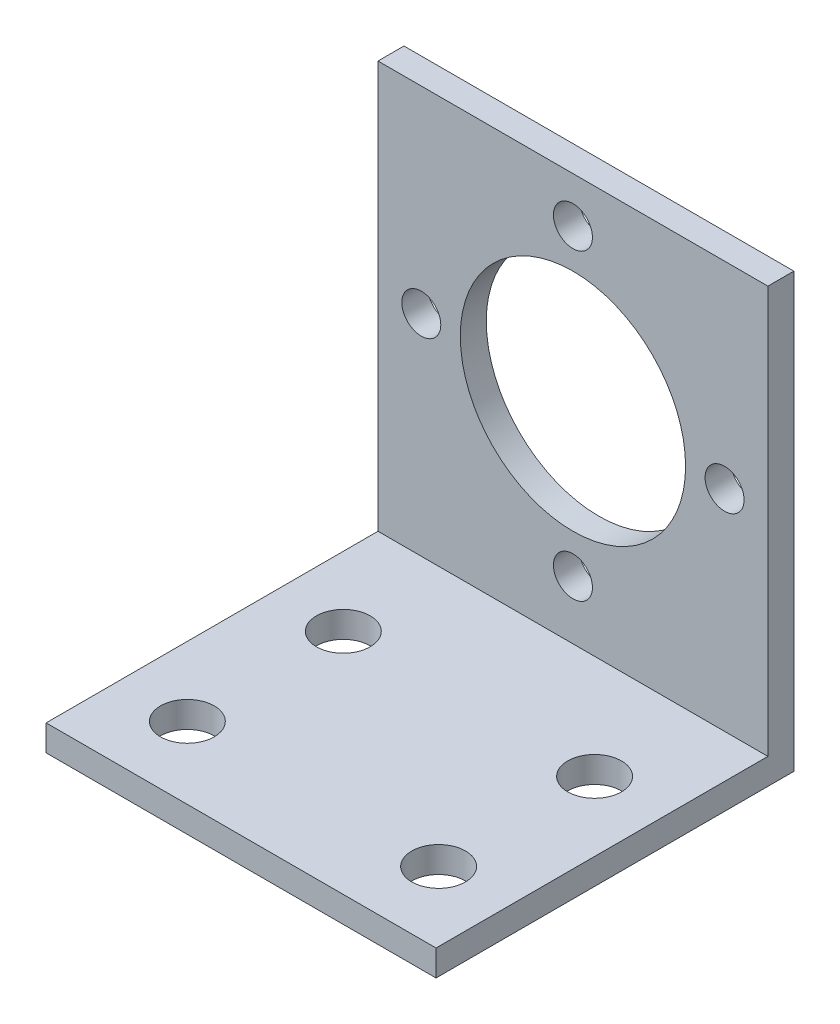
ISO-10303-21;
HEADER;
FILE_DESCRIPTION(('STEP AP214'),'2;1');
FILE_NAME('part.step','',(''),(''),'','','');
FILE_SCHEMA(('AUTOMOTIVE_DESIGN { 1 0 10303 214 1 1 1 1 }'));
ENDSEC;
DATA;
#1=APPLICATION_CONTEXT('core data for automotive mechanical design processes');
#2=APPLICATION_PROTOCOL_DEFINITION('international standard','automotive_design',2000,#1);
#3=PRODUCT_CONTEXT('',#1,'mechanical');
#4=PRODUCT('Part','Part','',(#3));
#5=PRODUCT_RELATED_PRODUCT_CATEGORY('part','',(#4));
#6=PRODUCT_DEFINITION_FORMATION('','',#4);
#7=PRODUCT_DEFINITION_CONTEXT('part definition',#1,'design');
#8=PRODUCT_DEFINITION('design','',#6,#7);
#9=PRODUCT_DEFINITION_SHAPE('','',#8);
#10=(LENGTH_UNIT() NAMED_UNIT(*) SI_UNIT(.MILLI.,.METRE.));
#11=(NAMED_UNIT(*) PLANE_ANGLE_UNIT() SI_UNIT($,.RADIAN.));
#12=(NAMED_UNIT(*) SI_UNIT($,.STERADIAN.) SOLID_ANGLE_UNIT());
#13=UNCERTAINTY_MEASURE_WITH_UNIT(LENGTH_MEASURE(1.E-05),#10,'distance_accuracy_value','');
#14=(GEOMETRIC_REPRESENTATION_CONTEXT(3) GLOBAL_UNCERTAINTY_ASSIGNED_CONTEXT((#13)) GLOBAL_UNIT_ASSIGNED_CONTEXT((#10,
#11,#12)) REPRESENTATION_CONTEXT('',''));
#15=CARTESIAN_POINT('',(0.,0.,0.));
#16=DIRECTION('',(0.,0.,1.));
#17=DIRECTION('',(1.,0.,0.));
#18=AXIS2_PLACEMENT_3D('',#15,#16,#17);
#19=CARTESIAN_POINT('',(0.,0.,3.));
#20=DIRECTION('',(1.,0.,0.));
#21=DIRECTION('',(0.,0.,-1.));
#22=AXIS2_PLACEMENT_3D('',#19,#20,#21);
#23=PLANE('',#22);
#24=DIRECTION('',(0.,-1.,0.));
#25=VECTOR('',#24,1.);
#26=CARTESIAN_POINT('',(0.,0.,0.));
#27=LINE('',#26,#25);
#28=CARTESIAN_POINT('',(0.,50.,0.));
#29=VERTEX_POINT('',#28);
#30=CARTESIAN_POINT('',(0.,0.,0.));
#31=VERTEX_POINT('',#30);
#32=EDGE_CURVE('E86',#29,#31,#27,.T.);
#33=ORIENTED_EDGE('',*,*,#32,.T.);
#34=DIRECTION('',(0.,0.,-1.));
#35=VECTOR('',#34,1.);
#36=CARTESIAN_POINT('',(0.,0.,3.));
#37=LINE('',#36,#35);
#38=CARTESIAN_POINT('',(0.,0.,41.3));
#39=VERTEX_POINT('',#38);
#40=EDGE_CURVE('E11',#39,#31,#37,.T.);
#41=ORIENTED_EDGE('',*,*,#40,.F.);
#42=DIRECTION('',(0.,1.,0.));
#43=VECTOR('',#42,1.);
#44=CARTESIAN_POINT('',(0.,3.,41.3));
#45=LINE('',#44,#43);
#46=CARTESIAN_POINT('',(0.,3.,41.3));
#47=VERTEX_POINT('',#46);
#48=EDGE_CURVE('E83',#39,#47,#45,.T.);
#49=ORIENTED_EDGE('',*,*,#48,.T.);
#50=DIRECTION('',(0.,0.,-1.));
#51=VECTOR('',#50,1.);
#52=CARTESIAN_POINT('',(0.,3.,41.3));
#53=LINE('',#52,#51);
#54=CARTESIAN_POINT('',(0.,3.,3.));
#55=VERTEX_POINT('',#54);
#56=EDGE_CURVE('E112',#47,#55,#53,.T.);
#57=ORIENTED_EDGE('',*,*,#56,.T.);
#58=DIRECTION('',(0.,-1.,0.));
#59=VECTOR('',#58,1.);
#60=CARTESIAN_POINT('',(0.,0.,3.));
#61=LINE('',#60,#59);
#62=CARTESIAN_POINT('',(0.,50.,3.));
#63=VERTEX_POINT('',#62);
#64=EDGE_CURVE('E51',#63,#55,#61,.T.);
#65=ORIENTED_EDGE('',*,*,#64,.F.);
#66=DIRECTION('',(0.,0.,-1.));
#67=VECTOR('',#66,1.);
#68=CARTESIAN_POINT('',(0.,50.,3.));
#69=LINE('',#68,#67);
#70=EDGE_CURVE('E124',#63,#29,#69,.T.);
#71=ORIENTED_EDGE('',*,*,#70,.T.);
#72=EDGE_LOOP('',(#33,#41,#49,#57,#65,#71));
#73=FACE_BOUND('',#72,.T.);
#74=ADVANCED_FACE('F32',(#73),#23,.F.);
#75=CARTESIAN_POINT('',(0.,0.,3.));
#76=DIRECTION('',(0.,1.,0.));
#77=DIRECTION('',(0.,0.,1.));
#78=AXIS2_PLACEMENT_3D('',#75,#76,#77);
#79=PLANE('',#78);
#80=CARTESIAN_POINT('',(8.,0.,15.));
#81=DIRECTION('',(0.,1.,0.));
#82=DIRECTION('',(-1.,0.,0.));
#83=AXIS2_PLACEMENT_3D('',#80,#81,#82);
#84=CIRCLE('',#83,3.1);
#85=CARTESIAN_POINT('',(4.9,0.,15.));
#86=VERTEX_POINT('',#85);
#87=EDGE_CURVE('E176',#86,#86,#84,.T.);
#88=ORIENTED_EDGE('',*,*,#87,.T.);
#89=EDGE_LOOP('',(#88));
#90=FACE_BOUND('',#89,.T.);
#91=CARTESIAN_POINT('',(8.,0.,33.));
#92=DIRECTION('',(0.,1.,0.));
#93=DIRECTION('',(-1.,0.,0.));
#94=AXIS2_PLACEMENT_3D('',#91,#92,#93);
#95=CIRCLE('',#94,3.1);
#96=CARTESIAN_POINT('',(4.9,0.,33.));
#97=VERTEX_POINT('',#96);
#98=EDGE_CURVE('E180',#97,#97,#95,.T.);
#99=ORIENTED_EDGE('',*,*,#98,.T.);
#100=EDGE_LOOP('',(#99));
#101=FACE_BOUND('',#100,.T.);
#102=CARTESIAN_POINT('',(37.,0.,33.));
#103=DIRECTION('',(0.,1.,0.));
#104=DIRECTION('',(-1.,0.,0.));
#105=AXIS2_PLACEMENT_3D('',#102,#103,#104);
#106=CIRCLE('',#105,3.09999999999999);
#107=CARTESIAN_POINT('',(33.9,0.,33.));
#108=VERTEX_POINT('',#107);
#109=EDGE_CURVE('E184',#108,#108,#106,.T.);
#110=ORIENTED_EDGE('',*,*,#109,.T.);
#111=EDGE_LOOP('',(#110));
#112=FACE_BOUND('',#111,.T.);
#113=CARTESIAN_POINT('',(37.,0.,15.));
#114=DIRECTION('',(0.,1.,0.));
#115=DIRECTION('',(-1.,0.,0.));
#116=AXIS2_PLACEMENT_3D('',#113,#114,#115);
#117=CIRCLE('',#116,3.1);
#118=CARTESIAN_POINT('',(33.9,0.,15.));
#119=VERTEX_POINT('',#118);
#120=EDGE_CURVE('E187',#119,#119,#117,.T.);
#121=ORIENTED_EDGE('',*,*,#120,.T.);
#122=EDGE_LOOP('',(#121));
#123=FACE_BOUND('',#122,.T.);
#124=DIRECTION('',(1.,0.,0.));
#125=VECTOR('',#124,1.);
#126=CARTESIAN_POINT('',(0.,0.,0.));
#127=LINE('',#126,#125);
#128=CARTESIAN_POINT('',(45.,0.,0.));
#129=VERTEX_POINT('',#128);
#130=EDGE_CURVE('E126',#31,#129,#127,.T.);
#131=ORIENTED_EDGE('',*,*,#130,.T.);
#132=DIRECTION('',(0.,0.,-1.));
#133=VECTOR('',#132,1.);
#134=CARTESIAN_POINT('',(45.,0.,3.));
#135=LINE('',#134,#133);
#136=CARTESIAN_POINT('',(45.,0.,41.3));
#137=VERTEX_POINT('',#136);
#138=EDGE_CURVE('E39',#137,#129,#135,.T.);
#139=ORIENTED_EDGE('',*,*,#138,.F.);
#140=DIRECTION('',(-1.,0.,0.));
#141=VECTOR('',#140,1.);
#142=CARTESIAN_POINT('',(0.,0.,41.3));
#143=LINE('',#142,#141);
#144=EDGE_CURVE('E95',#137,#39,#143,.T.);
#145=ORIENTED_EDGE('',*,*,#144,.T.);
#146=ORIENTED_EDGE('',*,*,#40,.T.);
#147=EDGE_LOOP('',(#131,#139,#145,#146));
#148=FACE_BOUND('',#147,.T.);
#149=ADVANCED_FACE('F100',(#90,#101,#112,#123,#148),#79,.F.);
#150=CARTESIAN_POINT('',(45.,0.,3.));
#151=DIRECTION('',(-1.,0.,0.));
#152=DIRECTION('',(0.,0.,1.));
#153=AXIS2_PLACEMENT_3D('',#150,#151,#152);
#154=PLANE('',#153);
#155=DIRECTION('',(0.,1.,0.));
#156=VECTOR('',#155,1.);
#157=CARTESIAN_POINT('',(45.,0.,3.));
#158=LINE('',#157,#156);
#159=CARTESIAN_POINT('',(45.,3.,3.));
#160=VERTEX_POINT('',#159);
#161=CARTESIAN_POINT('',(45.,50.,3.));
#162=VERTEX_POINT('',#161);
#163=EDGE_CURVE('E119',#160,#162,#158,.T.);
#164=ORIENTED_EDGE('',*,*,#163,.F.);
#165=DIRECTION('',(0.,0.,-1.));
#166=VECTOR('',#165,1.);
#167=CARTESIAN_POINT('',(45.,3.,41.3));
#168=LINE('',#167,#166);
#169=CARTESIAN_POINT('',(45.,3.,41.3));
#170=VERTEX_POINT('',#169);
#171=EDGE_CURVE('E113',#170,#160,#168,.T.);
#172=ORIENTED_EDGE('',*,*,#171,.F.);
#173=DIRECTION('',(0.,-1.,0.));
#174=VECTOR('',#173,1.);
#175=CARTESIAN_POINT('',(45.,0.,41.3));
#176=LINE('',#175,#174);
#177=EDGE_CURVE('E110',#170,#137,#176,.T.);
#178=ORIENTED_EDGE('',*,*,#177,.T.);
#179=ORIENTED_EDGE('',*,*,#138,.T.);
#180=DIRECTION('',(0.,1.,0.));
#181=VECTOR('',#180,1.);
#182=CARTESIAN_POINT('',(45.,0.,0.));
#183=LINE('',#182,#181);
#184=CARTESIAN_POINT('',(45.,50.,0.));
#185=VERTEX_POINT('',#184);
#186=EDGE_CURVE('E128',#129,#185,#183,.T.);
#187=ORIENTED_EDGE('',*,*,#186,.T.);
#188=DIRECTION('',(0.,0.,-1.));
#189=VECTOR('',#188,1.);
#190=CARTESIAN_POINT('',(45.,50.,3.));
#191=LINE('',#190,#189);
#192=EDGE_CURVE('E132',#162,#185,#191,.T.);
#193=ORIENTED_EDGE('',*,*,#192,.F.);
#194=EDGE_LOOP('',(#164,#172,#178,#179,#187,#193));
#195=FACE_BOUND('',#194,.T.);
#196=ADVANCED_FACE('F136',(#195),#154,.F.);
#197=CARTESIAN_POINT('',(0.,50.,3.));
#198=DIRECTION('',(0.,-1.,0.));
#199=DIRECTION('',(0.,0.,-1.));
#200=AXIS2_PLACEMENT_3D('',#197,#198,#199);
#201=PLANE('',#200);
#202=DIRECTION('',(-1.,0.,0.));
#203=VECTOR('',#202,1.);
#204=CARTESIAN_POINT('',(0.,50.,0.));
#205=LINE('',#204,#203);
#206=EDGE_CURVE('E120',#185,#29,#205,.T.);
#207=ORIENTED_EDGE('',*,*,#206,.T.);
#208=ORIENTED_EDGE('',*,*,#70,.F.);
#209=DIRECTION('',(-1.,0.,0.));
#210=VECTOR('',#209,1.);
#211=CARTESIAN_POINT('',(0.,50.,3.));
#212=LINE('',#211,#210);
#213=EDGE_CURVE('E122',#162,#63,#212,.T.);
#214=ORIENTED_EDGE('',*,*,#213,.F.);
#215=ORIENTED_EDGE('',*,*,#192,.T.);
#216=EDGE_LOOP('',(#207,#208,#214,#215));
#217=FACE_BOUND('',#216,.T.);
#218=ADVANCED_FACE('F143',(#217),#201,.F.);
#219=CARTESIAN_POINT('',(0.,0.,3.));
#220=DIRECTION('',(0.,0.,-1.));
#221=DIRECTION('',(-1.,0.,0.));
#222=AXIS2_PLACEMENT_3D('',#219,#220,#221);
#223=PLANE('',#222);
#224=CARTESIAN_POINT('',(22.5,44.75,3.));
#225=DIRECTION('',(0.,0.,1.));
#226=DIRECTION('',(1.,0.,0.));
#227=AXIS2_PLACEMENT_3D('',#224,#225,#226);
#228=CIRCLE('',#227,2.25);
#229=CARTESIAN_POINT('',(24.75,44.75,3.));
#230=VERTEX_POINT('',#229);
#231=EDGE_CURVE('E213',#230,#230,#228,.T.);
#232=ORIENTED_EDGE('',*,*,#231,.F.);
#233=EDGE_LOOP('',(#232));
#234=FACE_BOUND('',#233,.T.);
#235=CARTESIAN_POINT('',(40.,27.25,3.));
#236=DIRECTION('',(0.,0.,1.));
#237=DIRECTION('',(1.,0.,0.));
#238=AXIS2_PLACEMENT_3D('',#235,#236,#237);
#239=CIRCLE('',#238,2.25);
#240=CARTESIAN_POINT('',(42.25,27.25,3.));
#241=VERTEX_POINT('',#240);
#242=EDGE_CURVE('E204',#241,#241,#239,.T.);
#243=ORIENTED_EDGE('',*,*,#242,.F.);
#244=EDGE_LOOP('',(#243));
#245=FACE_BOUND('',#244,.T.);
#246=CARTESIAN_POINT('',(22.5,9.74999999999999,3.));
#247=DIRECTION('',(0.,0.,1.));
#248=DIRECTION('',(1.,0.,0.));
#249=AXIS2_PLACEMENT_3D('',#246,#247,#248);
#250=CIRCLE('',#249,2.25);
#251=CARTESIAN_POINT('',(24.75,9.74999999999999,3.));
#252=VERTEX_POINT('',#251);
#253=EDGE_CURVE('E205',#252,#252,#250,.T.);
#254=ORIENTED_EDGE('',*,*,#253,.F.);
#255=EDGE_LOOP('',(#254));
#256=FACE_BOUND('',#255,.T.);
#257=CARTESIAN_POINT('',(4.99999999999999,27.25,3.));
#258=DIRECTION('',(0.,0.,1.));
#259=DIRECTION('',(1.,0.,0.));
#260=AXIS2_PLACEMENT_3D('',#257,#258,#259);
#261=CIRCLE('',#260,2.25);
#262=CARTESIAN_POINT('',(7.24999999999999,27.25,3.));
#263=VERTEX_POINT('',#262);
#264=EDGE_CURVE('E189',#263,#263,#261,.T.);
#265=ORIENTED_EDGE('',*,*,#264,.F.);
#266=EDGE_LOOP('',(#265));
#267=FACE_BOUND('',#266,.T.);
#268=CARTESIAN_POINT('',(22.5,27.25,3.));
#269=DIRECTION('',(0.,0.,1.));
#270=DIRECTION('',(1.,0.,0.));
#271=AXIS2_PLACEMENT_3D('',#268,#269,#270);
#272=CIRCLE('',#271,13.);
#273=CARTESIAN_POINT('',(35.5,27.25,3.));
#274=VERTEX_POINT('',#273);
#275=EDGE_CURVE('E105',#274,#274,#272,.T.);
#276=ORIENTED_EDGE('',*,*,#275,.F.);
#277=EDGE_LOOP('',(#276));
#278=FACE_BOUND('',#277,.T.);
#279=ORIENTED_EDGE('',*,*,#64,.T.);
#280=DIRECTION('',(1.,0.,0.));
#281=VECTOR('',#280,1.);
#282=CARTESIAN_POINT('',(0.,3.,3.));
#283=LINE('',#282,#281);
#284=EDGE_CURVE('E46',#55,#160,#283,.T.);
#285=ORIENTED_EDGE('',*,*,#284,.T.);
#286=ORIENTED_EDGE('',*,*,#163,.T.);
#287=ORIENTED_EDGE('',*,*,#213,.T.);
#288=EDGE_LOOP('',(#279,#285,#286,#287));
#289=FACE_BOUND('',#288,.T.);
#290=ADVANCED_FACE('F147',(#234,#245,#256,#267,#278,#289),#223,.F.);
#291=CARTESIAN_POINT('',(0.,0.,0.));
#292=DIRECTION('',(0.,0.,-1.));
#293=DIRECTION('',(-1.,0.,0.));
#294=AXIS2_PLACEMENT_3D('',#291,#292,#293);
#295=PLANE('',#294);
#296=CARTESIAN_POINT('',(22.5,44.75,0.));
#297=DIRECTION('',(0.,0.,1.));
#298=DIRECTION('',(1.,0.,0.));
#299=AXIS2_PLACEMENT_3D('',#296,#297,#298);
#300=CIRCLE('',#299,2.25);
#301=CARTESIAN_POINT('',(24.75,44.75,0.));
#302=VERTEX_POINT('',#301);
#303=EDGE_CURVE('E210',#302,#302,#300,.T.);
#304=ORIENTED_EDGE('',*,*,#303,.T.);
#305=EDGE_LOOP('',(#304));
#306=FACE_BOUND('',#305,.T.);
#307=CARTESIAN_POINT('',(40.,27.25,0.));
#308=DIRECTION('',(0.,0.,1.));
#309=DIRECTION('',(1.,0.,0.));
#310=AXIS2_PLACEMENT_3D('',#307,#308,#309);
#311=CIRCLE('',#310,2.25);
#312=CARTESIAN_POINT('',(42.25,27.25,0.));
#313=VERTEX_POINT('',#312);
#314=EDGE_CURVE('E216',#313,#313,#311,.T.);
#315=ORIENTED_EDGE('',*,*,#314,.T.);
#316=EDGE_LOOP('',(#315));
#317=FACE_BOUND('',#316,.T.);
#318=CARTESIAN_POINT('',(22.5,9.74999999999999,0.));
#319=DIRECTION('',(0.,0.,1.));
#320=DIRECTION('',(1.,0.,0.));
#321=AXIS2_PLACEMENT_3D('',#318,#319,#320);
#322=CIRCLE('',#321,2.25);
#323=CARTESIAN_POINT('',(24.75,9.74999999999999,0.));
#324=VERTEX_POINT('',#323);
#325=EDGE_CURVE('E201',#324,#324,#322,.T.);
#326=ORIENTED_EDGE('',*,*,#325,.T.);
#327=EDGE_LOOP('',(#326));
#328=FACE_BOUND('',#327,.T.);
#329=CARTESIAN_POINT('',(4.99999999999999,27.25,0.));
#330=DIRECTION('',(0.,0.,1.));
#331=DIRECTION('',(1.,0.,0.));
#332=AXIS2_PLACEMENT_3D('',#329,#330,#331);
#333=CIRCLE('',#332,2.25);
#334=CARTESIAN_POINT('',(7.24999999999999,27.25,0.));
#335=VERTEX_POINT('',#334);
#336=EDGE_CURVE('E193',#335,#335,#333,.T.);
#337=ORIENTED_EDGE('',*,*,#336,.T.);
#338=EDGE_LOOP('',(#337));
#339=FACE_BOUND('',#338,.T.);
#340=CARTESIAN_POINT('',(22.5,27.25,0.));
#341=DIRECTION('',(0.,0.,1.));
#342=DIRECTION('',(1.,0.,0.));
#343=AXIS2_PLACEMENT_3D('',#340,#341,#342);
#344=CIRCLE('',#343,13.);
#345=CARTESIAN_POINT('',(35.5,27.25,0.));
#346=VERTEX_POINT('',#345);
#347=EDGE_CURVE('E102',#346,#346,#344,.T.);
#348=ORIENTED_EDGE('',*,*,#347,.T.);
#349=EDGE_LOOP('',(#348));
#350=FACE_BOUND('',#349,.T.);
#351=ORIENTED_EDGE('',*,*,#206,.F.);
#352=ORIENTED_EDGE('',*,*,#186,.F.);
#353=ORIENTED_EDGE('',*,*,#130,.F.);
#354=ORIENTED_EDGE('',*,*,#32,.F.);
#355=EDGE_LOOP('',(#351,#352,#353,#354));
#356=FACE_BOUND('',#355,.T.);
#357=ADVANCED_FACE('F140',(#306,#317,#328,#339,#350,#356),#295,.T.);
#358=CARTESIAN_POINT('',(45.,3.,41.3));
#359=DIRECTION('',(0.,1.,0.));
#360=DIRECTION('',(-1.,0.,0.));
#361=AXIS2_PLACEMENT_3D('',#358,#359,#360);
#362=PLANE('',#361);
#363=CARTESIAN_POINT('',(8.,3.,15.));
#364=DIRECTION('',(0.,1.,0.));
#365=DIRECTION('',(-1.,0.,0.));
#366=AXIS2_PLACEMENT_3D('',#363,#364,#365);
#367=CIRCLE('',#366,3.1);
#368=CARTESIAN_POINT('',(4.9,3.,15.));
#369=VERTEX_POINT('',#368);
#370=EDGE_CURVE('E198',#369,#369,#367,.T.);
#371=ORIENTED_EDGE('',*,*,#370,.F.);
#372=EDGE_LOOP('',(#371));
#373=FACE_BOUND('',#372,.T.);
#374=CARTESIAN_POINT('',(8.,3.,33.));
#375=DIRECTION('',(0.,1.,0.));
#376=DIRECTION('',(-1.,0.,0.));
#377=AXIS2_PLACEMENT_3D('',#374,#375,#376);
#378=CIRCLE('',#377,3.1);
#379=CARTESIAN_POINT('',(4.9,3.,33.));
#380=VERTEX_POINT('',#379);
#381=EDGE_CURVE('E257',#380,#380,#378,.T.);
#382=ORIENTED_EDGE('',*,*,#381,.F.);
#383=EDGE_LOOP('',(#382));
#384=FACE_BOUND('',#383,.T.);
#385=CARTESIAN_POINT('',(37.,3.,33.));
#386=DIRECTION('',(0.,1.,0.));
#387=DIRECTION('',(-1.,0.,0.));
#388=AXIS2_PLACEMENT_3D('',#385,#386,#387);
#389=CIRCLE('',#388,3.09999999999999);
#390=CARTESIAN_POINT('',(33.9,3.,33.));
#391=VERTEX_POINT('',#390);
#392=EDGE_CURVE('E261',#391,#391,#389,.T.);
#393=ORIENTED_EDGE('',*,*,#392,.F.);
#394=EDGE_LOOP('',(#393));
#395=FACE_BOUND('',#394,.T.);
#396=CARTESIAN_POINT('',(37.,3.,15.));
#397=DIRECTION('',(0.,1.,0.));
#398=DIRECTION('',(-1.,0.,0.));
#399=AXIS2_PLACEMENT_3D('',#396,#397,#398);
#400=CIRCLE('',#399,3.1);
#401=CARTESIAN_POINT('',(33.9,3.,15.));
#402=VERTEX_POINT('',#401);
#403=EDGE_CURVE('E190',#402,#402,#400,.T.);
#404=ORIENTED_EDGE('',*,*,#403,.F.);
#405=EDGE_LOOP('',(#404));
#406=FACE_BOUND('',#405,.T.);
#407=ORIENTED_EDGE('',*,*,#284,.F.);
#408=ORIENTED_EDGE('',*,*,#56,.F.);
#409=DIRECTION('',(1.,0.,0.));
#410=VECTOR('',#409,1.);
#411=CARTESIAN_POINT('',(45.,3.,41.3));
#412=LINE('',#411,#410);
#413=EDGE_CURVE('E98',#47,#170,#412,.T.);
#414=ORIENTED_EDGE('',*,*,#413,.T.);
#415=ORIENTED_EDGE('',*,*,#171,.T.);
#416=EDGE_LOOP('',(#407,#408,#414,#415));
#417=FACE_BOUND('',#416,.T.);
#418=ADVANCED_FACE('F146',(#373,#384,#395,#406,#417),#362,.T.);
#419=CARTESIAN_POINT('',(0.,0.,41.3));
#420=DIRECTION('',(0.,0.,1.));
#421=DIRECTION('',(1.,0.,0.));
#422=AXIS2_PLACEMENT_3D('',#419,#420,#421);
#423=PLANE('',#422);
#424=ORIENTED_EDGE('',*,*,#144,.F.);
#425=ORIENTED_EDGE('',*,*,#177,.F.);
#426=ORIENTED_EDGE('',*,*,#413,.F.);
#427=ORIENTED_EDGE('',*,*,#48,.F.);
#428=EDGE_LOOP('',(#424,#425,#426,#427));
#429=FACE_BOUND('',#428,.T.);
#430=ADVANCED_FACE('F93',(#429),#423,.T.);
#431=CARTESIAN_POINT('',(22.5,27.25,0.));
#432=DIRECTION('',(0.,0.,1.));
#433=DIRECTION('',(1.,0.,0.));
#434=AXIS2_PLACEMENT_3D('',#431,#432,#433);
#435=CYLINDRICAL_SURFACE('',#434,13.);
#436=ORIENTED_EDGE('',*,*,#347,.F.);
#437=EDGE_LOOP('',(#436));
#438=FACE_BOUND('',#437,.T.);
#439=ORIENTED_EDGE('',*,*,#275,.T.);
#440=EDGE_LOOP('',(#439));
#441=FACE_BOUND('',#440,.T.);
#442=ADVANCED_FACE('F231',(#438,#441),#435,.F.);
#443=CARTESIAN_POINT('',(4.99999999999999,27.25,0.));
#444=DIRECTION('',(0.,0.,1.));
#445=DIRECTION('',(1.,0.,0.));
#446=AXIS2_PLACEMENT_3D('',#443,#444,#445);
#447=CYLINDRICAL_SURFACE('',#446,2.25);
#448=ORIENTED_EDGE('',*,*,#336,.F.);
#449=EDGE_LOOP('',(#448));
#450=FACE_BOUND('',#449,.T.);
#451=ORIENTED_EDGE('',*,*,#264,.T.);
#452=EDGE_LOOP('',(#451));
#453=FACE_BOUND('',#452,.T.);
#454=ADVANCED_FACE('F233',(#450,#453),#447,.F.);
#455=CARTESIAN_POINT('',(22.5,9.74999999999999,0.));
#456=DIRECTION('',(0.,0.,1.));
#457=DIRECTION('',(1.,0.,0.));
#458=AXIS2_PLACEMENT_3D('',#455,#456,#457);
#459=CYLINDRICAL_SURFACE('',#458,2.25);
#460=ORIENTED_EDGE('',*,*,#325,.F.);
#461=EDGE_LOOP('',(#460));
#462=FACE_BOUND('',#461,.T.);
#463=ORIENTED_EDGE('',*,*,#253,.T.);
#464=EDGE_LOOP('',(#463));
#465=FACE_BOUND('',#464,.T.);
#466=ADVANCED_FACE('F240',(#462,#465),#459,.F.);
#467=CARTESIAN_POINT('',(40.,27.25,0.));
#468=DIRECTION('',(0.,0.,1.));
#469=DIRECTION('',(1.,0.,0.));
#470=AXIS2_PLACEMENT_3D('',#467,#468,#469);
#471=CYLINDRICAL_SURFACE('',#470,2.25);
#472=ORIENTED_EDGE('',*,*,#314,.F.);
#473=EDGE_LOOP('',(#472));
#474=FACE_BOUND('',#473,.T.);
#475=ORIENTED_EDGE('',*,*,#242,.T.);
#476=EDGE_LOOP('',(#475));
#477=FACE_BOUND('',#476,.T.);
#478=ADVANCED_FACE('F222',(#474,#477),#471,.F.);
#479=CARTESIAN_POINT('',(22.5,44.75,0.));
#480=DIRECTION('',(0.,0.,1.));
#481=DIRECTION('',(1.,0.,0.));
#482=AXIS2_PLACEMENT_3D('',#479,#480,#481);
#483=CYLINDRICAL_SURFACE('',#482,2.25);
#484=ORIENTED_EDGE('',*,*,#303,.F.);
#485=EDGE_LOOP('',(#484));
#486=FACE_BOUND('',#485,.T.);
#487=ORIENTED_EDGE('',*,*,#231,.T.);
#488=EDGE_LOOP('',(#487));
#489=FACE_BOUND('',#488,.T.);
#490=ADVANCED_FACE('F267',(#486,#489),#483,.F.);
#491=CARTESIAN_POINT('',(37.,0.,15.));
#492=DIRECTION('',(0.,1.,0.));
#493=DIRECTION('',(-1.,0.,0.));
#494=AXIS2_PLACEMENT_3D('',#491,#492,#493);
#495=CYLINDRICAL_SURFACE('',#494,3.1);
#496=ORIENTED_EDGE('',*,*,#120,.F.);
#497=EDGE_LOOP('',(#496));
#498=FACE_BOUND('',#497,.T.);
#499=ORIENTED_EDGE('',*,*,#403,.T.);
#500=EDGE_LOOP('',(#499));
#501=FACE_BOUND('',#500,.T.);
#502=ADVANCED_FACE('F264',(#498,#501),#495,.F.);
#503=CARTESIAN_POINT('',(37.,0.,33.));
#504=DIRECTION('',(0.,1.,0.));
#505=DIRECTION('',(-1.,0.,0.));
#506=AXIS2_PLACEMENT_3D('',#503,#504,#505);
#507=CYLINDRICAL_SURFACE('',#506,3.09999999999999);
#508=ORIENTED_EDGE('',*,*,#109,.F.);
#509=EDGE_LOOP('',(#508));
#510=FACE_BOUND('',#509,.T.);
#511=ORIENTED_EDGE('',*,*,#392,.T.);
#512=EDGE_LOOP('',(#511));
#513=FACE_BOUND('',#512,.T.);
#514=ADVANCED_FACE('F266',(#510,#513),#507,.F.);
#515=CARTESIAN_POINT('',(8.,0.,33.));
#516=DIRECTION('',(0.,1.,0.));
#517=DIRECTION('',(-1.,0.,0.));
#518=AXIS2_PLACEMENT_3D('',#515,#516,#517);
#519=CYLINDRICAL_SURFACE('',#518,3.1);
#520=ORIENTED_EDGE('',*,*,#98,.F.);
#521=EDGE_LOOP('',(#520));
#522=FACE_BOUND('',#521,.T.);
#523=ORIENTED_EDGE('',*,*,#381,.T.);
#524=EDGE_LOOP('',(#523));
#525=FACE_BOUND('',#524,.T.);
#526=ADVANCED_FACE('F272',(#522,#525),#519,.F.);
#527=CARTESIAN_POINT('',(8.,0.,15.));
#528=DIRECTION('',(0.,1.,0.));
#529=DIRECTION('',(-1.,0.,0.));
#530=AXIS2_PLACEMENT_3D('',#527,#528,#529);
#531=CYLINDRICAL_SURFACE('',#530,3.1);
#532=ORIENTED_EDGE('',*,*,#87,.F.);
#533=EDGE_LOOP('',(#532));
#534=FACE_BOUND('',#533,.T.);
#535=ORIENTED_EDGE('',*,*,#370,.T.);
#536=EDGE_LOOP('',(#535));
#537=FACE_BOUND('',#536,.T.);
#538=ADVANCED_FACE('F278',(#534,#537),#531,.F.);
#539=CLOSED_SHELL('',(#74,#149,#196,#218,#290,#357,#418,#430,#442,#454,#466,#478,#490,#502,#514,
#526,#538));
#540=MANIFOLD_SOLID_BREP('B2',#539);
#541=ADVANCED_BREP_SHAPE_REPRESENTATION('',(#18,#540),#14);
#542=SHAPE_DEFINITION_REPRESENTATION(#9,#541);
ENDSEC;
END-ISO-10303-21;
